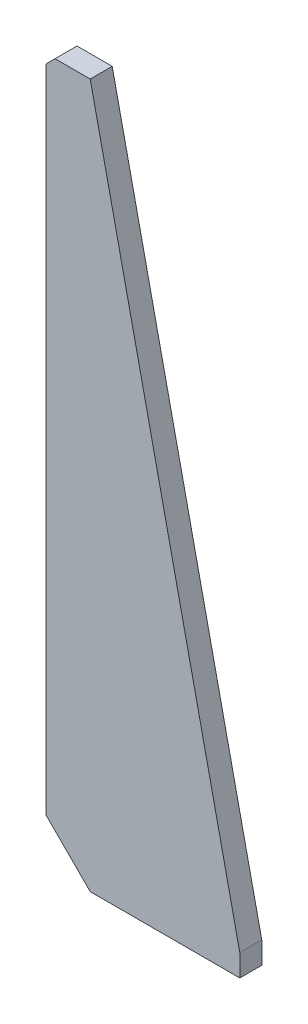
ISO-10303-21;
HEADER;
FILE_DESCRIPTION(('STEP AP214'),'2;1');
FILE_NAME('part.step','',(''),(''),'','','');
FILE_SCHEMA(('AUTOMOTIVE_DESIGN { 1 0 10303 214 1 1 1 1 }'));
ENDSEC;
DATA;
#1=APPLICATION_CONTEXT('core data for automotive mechanical design processes');
#2=APPLICATION_PROTOCOL_DEFINITION('international standard','automotive_design',2000,#1);
#3=PRODUCT_CONTEXT('',#1,'mechanical');
#4=PRODUCT('Part','Part','',(#3));
#5=PRODUCT_RELATED_PRODUCT_CATEGORY('part','',(#4));
#6=PRODUCT_DEFINITION_FORMATION('','',#4);
#7=PRODUCT_DEFINITION_CONTEXT('part definition',#1,'design');
#8=PRODUCT_DEFINITION('design','',#6,#7);
#9=PRODUCT_DEFINITION_SHAPE('','',#8);
#10=(LENGTH_UNIT() NAMED_UNIT(*) SI_UNIT(.MILLI.,.METRE.));
#11=(NAMED_UNIT(*) PLANE_ANGLE_UNIT() SI_UNIT($,.RADIAN.));
#12=(NAMED_UNIT(*) SI_UNIT($,.STERADIAN.) SOLID_ANGLE_UNIT());
#13=UNCERTAINTY_MEASURE_WITH_UNIT(LENGTH_MEASURE(1.E-05),#10,'distance_accuracy_value','');
#14=(GEOMETRIC_REPRESENTATION_CONTEXT(3) GLOBAL_UNCERTAINTY_ASSIGNED_CONTEXT((#13)) GLOBAL_UNIT_ASSIGNED_CONTEXT((#10,
#11,#12)) REPRESENTATION_CONTEXT('',''));
#15=CARTESIAN_POINT('',(0.,0.,0.));
#16=DIRECTION('',(0.,0.,1.));
#17=DIRECTION('',(1.,0.,0.));
#18=AXIS2_PLACEMENT_3D('',#15,#16,#17);
#19=CARTESIAN_POINT('',(44.,0.,2.5));
#20=DIRECTION('',(0.,1.,0.));
#21=DIRECTION('',(-1.,0.,0.));
#22=AXIS2_PLACEMENT_3D('',#19,#20,#21);
#23=PLANE('',#22);
#24=DIRECTION('',(1.,0.,0.));
#25=VECTOR('',#24,1.);
#26=CARTESIAN_POINT('',(44.,0.,2.5));
#27=LINE('',#26,#25);
#28=CARTESIAN_POINT('',(10.,0.,2.5));
#29=VERTEX_POINT('',#28);
#30=CARTESIAN_POINT('',(44.,0.,2.5));
#31=VERTEX_POINT('',#30);
#32=EDGE_CURVE('E102',#29,#31,#27,.T.);
#33=ORIENTED_EDGE('',*,*,#32,.F.);
#34=DIRECTION('',(0.,0.,-1.));
#35=VECTOR('',#34,1.);
#36=CARTESIAN_POINT('',(10.,0.,2.5));
#37=LINE('',#36,#35);
#38=CARTESIAN_POINT('',(10.,0.,-2.5));
#39=VERTEX_POINT('',#38);
#40=EDGE_CURVE('E127',#29,#39,#37,.T.);
#41=ORIENTED_EDGE('',*,*,#40,.T.);
#42=DIRECTION('',(1.,0.,0.));
#43=VECTOR('',#42,1.);
#44=CARTESIAN_POINT('',(44.,0.,-2.5));
#45=LINE('',#44,#43);
#46=CARTESIAN_POINT('',(44.,0.,-2.5));
#47=VERTEX_POINT('',#46);
#48=EDGE_CURVE('E125',#39,#47,#45,.T.);
#49=ORIENTED_EDGE('',*,*,#48,.T.);
#50=DIRECTION('',(0.,0.,-1.));
#51=VECTOR('',#50,1.);
#52=CARTESIAN_POINT('',(44.,0.,2.5));
#53=LINE('',#52,#51);
#54=EDGE_CURVE('E118',#31,#47,#53,.T.);
#55=ORIENTED_EDGE('',*,*,#54,.F.);
#56=EDGE_LOOP('',(#33,#41,#49,#55));
#57=FACE_BOUND('',#56,.T.);
#58=ADVANCED_FACE('F43',(#57),#23,.F.);
#59=CARTESIAN_POINT('',(44.,5.,2.5));
#60=DIRECTION('',(-1.,0.,0.));
#61=DIRECTION('',(0.,0.,1.));
#62=AXIS2_PLACEMENT_3D('',#59,#60,#61);
#63=PLANE('',#62);
#64=DIRECTION('',(0.,1.,0.));
#65=VECTOR('',#64,1.);
#66=CARTESIAN_POINT('',(44.,5.,-2.5));
#67=LINE('',#66,#65);
#68=CARTESIAN_POINT('',(44.,5.,-2.5));
#69=VERTEX_POINT('',#68);
#70=EDGE_CURVE('E166',#47,#69,#67,.T.);
#71=ORIENTED_EDGE('',*,*,#70,.T.);
#72=DIRECTION('',(0.,0.,-1.));
#73=VECTOR('',#72,1.);
#74=CARTESIAN_POINT('',(44.,5.,2.5));
#75=LINE('',#74,#73);
#76=CARTESIAN_POINT('',(44.,5.,2.5));
#77=VERTEX_POINT('',#76);
#78=EDGE_CURVE('E120',#77,#69,#75,.T.);
#79=ORIENTED_EDGE('',*,*,#78,.F.);
#80=DIRECTION('',(0.,1.,0.));
#81=VECTOR('',#80,1.);
#82=CARTESIAN_POINT('',(44.,5.,2.5));
#83=LINE('',#82,#81);
#84=EDGE_CURVE('E105',#31,#77,#83,.T.);
#85=ORIENTED_EDGE('',*,*,#84,.F.);
#86=ORIENTED_EDGE('',*,*,#54,.T.);
#87=EDGE_LOOP('',(#71,#79,#85,#86));
#88=FACE_BOUND('',#87,.T.);
#89=ADVANCED_FACE('F117',(#88),#63,.F.);
#90=CARTESIAN_POINT('',(10.,160.,2.5));
#91=DIRECTION('',(-0.976776520618856,-0.214260656135749,0.));
#92=DIRECTION('',(0.214260656135749,-0.976776520618856,0.));
#93=AXIS2_PLACEMENT_3D('',#90,#91,#92);
#94=PLANE('',#93);
#95=DIRECTION('',(-0.214260656135749,0.976776520618856,0.));
#96=VECTOR('',#95,1.);
#97=CARTESIAN_POINT('',(10.,160.,-2.5));
#98=LINE('',#97,#96);
#99=CARTESIAN_POINT('',(10.,160.,-2.5));
#100=VERTEX_POINT('',#99);
#101=EDGE_CURVE('E155',#69,#100,#98,.T.);
#102=ORIENTED_EDGE('',*,*,#101,.T.);
#103=DIRECTION('',(0.,0.,-1.));
#104=VECTOR('',#103,1.);
#105=CARTESIAN_POINT('',(10.,160.,2.5));
#106=LINE('',#105,#104);
#107=CARTESIAN_POINT('',(10.,160.,2.5));
#108=VERTEX_POINT('',#107);
#109=EDGE_CURVE('E131',#108,#100,#106,.T.);
#110=ORIENTED_EDGE('',*,*,#109,.F.);
#111=DIRECTION('',(-0.214260656135749,0.976776520618856,0.));
#112=VECTOR('',#111,1.);
#113=CARTESIAN_POINT('',(10.,160.,2.5));
#114=LINE('',#113,#112);
#115=EDGE_CURVE('E122',#77,#108,#114,.T.);
#116=ORIENTED_EDGE('',*,*,#115,.F.);
#117=ORIENTED_EDGE('',*,*,#78,.T.);
#118=EDGE_LOOP('',(#102,#110,#116,#117));
#119=FACE_BOUND('',#118,.T.);
#120=ADVANCED_FACE('F169',(#119),#94,.F.);
#121=CARTESIAN_POINT('',(0.,160.,2.5));
#122=DIRECTION('',(0.,-1.,0.));
#123=DIRECTION('',(0.,0.,-1.));
#124=AXIS2_PLACEMENT_3D('',#121,#122,#123);
#125=PLANE('',#124);
#126=DIRECTION('',(-1.,0.,0.));
#127=VECTOR('',#126,1.);
#128=CARTESIAN_POINT('',(0.,160.,-2.5));
#129=LINE('',#128,#127);
#130=CARTESIAN_POINT('',(2.,160.,-2.5));
#131=VERTEX_POINT('',#130);
#132=EDGE_CURVE('E153',#100,#131,#129,.T.);
#133=ORIENTED_EDGE('',*,*,#132,.T.);
#134=DIRECTION('',(0.,0.,1.));
#135=VECTOR('',#134,1.);
#136=CARTESIAN_POINT('',(2.,160.,2.5));
#137=LINE('',#136,#135);
#138=CARTESIAN_POINT('',(2.,160.,2.5));
#139=VERTEX_POINT('',#138);
#140=EDGE_CURVE('E52',#131,#139,#137,.T.);
#141=ORIENTED_EDGE('',*,*,#140,.T.);
#142=DIRECTION('',(-1.,0.,0.));
#143=VECTOR('',#142,1.);
#144=CARTESIAN_POINT('',(0.,160.,2.5));
#145=LINE('',#144,#143);
#146=EDGE_CURVE('E160',#108,#139,#145,.T.);
#147=ORIENTED_EDGE('',*,*,#146,.F.);
#148=ORIENTED_EDGE('',*,*,#109,.T.);
#149=EDGE_LOOP('',(#133,#141,#147,#148));
#150=FACE_BOUND('',#149,.T.);
#151=ADVANCED_FACE('F170',(#150),#125,.F.);
#152=CARTESIAN_POINT('',(0.,0.,2.5));
#153=DIRECTION('',(1.,0.,0.));
#154=DIRECTION('',(0.,0.,-1.));
#155=AXIS2_PLACEMENT_3D('',#152,#153,#154);
#156=PLANE('',#155);
#157=DIRECTION('',(0.,-1.,0.));
#158=VECTOR('',#157,1.);
#159=CARTESIAN_POINT('',(0.,0.,2.5));
#160=LINE('',#159,#158);
#161=CARTESIAN_POINT('',(0.,158.,2.5));
#162=VERTEX_POINT('',#161);
#163=CARTESIAN_POINT('',(0.,10.,2.5));
#164=VERTEX_POINT('',#163);
#165=EDGE_CURVE('E148',#162,#164,#160,.T.);
#166=ORIENTED_EDGE('',*,*,#165,.F.);
#167=DIRECTION('',(0.,0.,-1.));
#168=VECTOR('',#167,1.);
#169=CARTESIAN_POINT('',(0.,158.,2.5));
#170=LINE('',#169,#168);
#171=CARTESIAN_POINT('',(0.,158.,-2.5));
#172=VERTEX_POINT('',#171);
#173=EDGE_CURVE('E141',#162,#172,#170,.T.);
#174=ORIENTED_EDGE('',*,*,#173,.T.);
#175=DIRECTION('',(0.,-1.,0.));
#176=VECTOR('',#175,1.);
#177=CARTESIAN_POINT('',(0.,0.,-2.5));
#178=LINE('',#177,#176);
#179=CARTESIAN_POINT('',(0.,10.,-2.5));
#180=VERTEX_POINT('',#179);
#181=EDGE_CURVE('E113',#172,#180,#178,.T.);
#182=ORIENTED_EDGE('',*,*,#181,.T.);
#183=DIRECTION('',(0.,0.,1.));
#184=VECTOR('',#183,1.);
#185=CARTESIAN_POINT('',(0.,10.,2.5));
#186=LINE('',#185,#184);
#187=EDGE_CURVE('E137',#180,#164,#186,.T.);
#188=ORIENTED_EDGE('',*,*,#187,.T.);
#189=EDGE_LOOP('',(#166,#174,#182,#188));
#190=FACE_BOUND('',#189,.T.);
#191=ADVANCED_FACE('F147',(#190),#156,.F.);
#192=CARTESIAN_POINT('',(0.,0.,2.5));
#193=DIRECTION('',(0.,0.,-1.));
#194=DIRECTION('',(-1.,0.,0.));
#195=AXIS2_PLACEMENT_3D('',#192,#193,#194);
#196=PLANE('',#195);
#197=ORIENTED_EDGE('',*,*,#146,.T.);
#198=DIRECTION('',(0.707106781186543,0.707106781186552,0.));
#199=VECTOR('',#198,1.);
#200=CARTESIAN_POINT('',(0.,158.,2.5));
#201=LINE('',#200,#199);
#202=EDGE_CURVE('E11',#139,#162,#201,.F.);
#203=ORIENTED_EDGE('',*,*,#202,.T.);
#204=ORIENTED_EDGE('',*,*,#165,.T.);
#205=DIRECTION('',(-0.707106781186546,0.707106781186549,0.));
#206=VECTOR('',#205,1.);
#207=CARTESIAN_POINT('',(10.,0.,2.5));
#208=LINE('',#207,#206);
#209=EDGE_CURVE('E108',#164,#29,#208,.F.);
#210=ORIENTED_EDGE('',*,*,#209,.T.);
#211=ORIENTED_EDGE('',*,*,#32,.T.);
#212=ORIENTED_EDGE('',*,*,#84,.T.);
#213=ORIENTED_EDGE('',*,*,#115,.T.);
#214=EDGE_LOOP('',(#197,#203,#204,#210,#211,#212,#213));
#215=FACE_BOUND('',#214,.T.);
#216=ADVANCED_FACE('F104',(#215),#196,.F.);
#217=CARTESIAN_POINT('',(0.,0.,-2.5));
#218=DIRECTION('',(0.,0.,-1.));
#219=DIRECTION('',(-1.,0.,0.));
#220=AXIS2_PLACEMENT_3D('',#217,#218,#219);
#221=PLANE('',#220);
#222=ORIENTED_EDGE('',*,*,#181,.F.);
#223=DIRECTION('',(-0.707106781186543,-0.707106781186552,0.));
#224=VECTOR('',#223,1.);
#225=CARTESIAN_POINT('',(-79.,78.9999999999989,-2.5));
#226=LINE('',#225,#224);
#227=EDGE_CURVE('E66',#172,#131,#226,.F.);
#228=ORIENTED_EDGE('',*,*,#227,.T.);
#229=ORIENTED_EDGE('',*,*,#132,.F.);
#230=ORIENTED_EDGE('',*,*,#101,.F.);
#231=ORIENTED_EDGE('',*,*,#70,.F.);
#232=ORIENTED_EDGE('',*,*,#48,.F.);
#233=DIRECTION('',(0.707106781186546,-0.707106781186549,0.));
#234=VECTOR('',#233,1.);
#235=CARTESIAN_POINT('',(5.00000000000002,5.,-2.5));
#236=LINE('',#235,#234);
#237=EDGE_CURVE('E129',#39,#180,#236,.F.);
#238=ORIENTED_EDGE('',*,*,#237,.T.);
#239=EDGE_LOOP('',(#222,#228,#229,#230,#231,#232,#238));
#240=FACE_BOUND('',#239,.T.);
#241=ADVANCED_FACE('F151',(#240),#221,.T.);
#242=CARTESIAN_POINT('',(10.,0.,2.5));
#243=DIRECTION('',(0.707106781186549,0.707106781186546,0.));
#244=DIRECTION('',(0.,0.,-1.));
#245=AXIS2_PLACEMENT_3D('',#242,#243,#244);
#246=PLANE('',#245);
#247=ORIENTED_EDGE('',*,*,#209,.F.);
#248=ORIENTED_EDGE('',*,*,#187,.F.);
#249=ORIENTED_EDGE('',*,*,#237,.F.);
#250=ORIENTED_EDGE('',*,*,#40,.F.);
#251=EDGE_LOOP('',(#247,#248,#249,#250));
#252=FACE_BOUND('',#251,.T.);
#253=ADVANCED_FACE('F172',(#252),#246,.F.);
#254=CARTESIAN_POINT('',(0.,158.,2.5));
#255=DIRECTION('',(0.707106781186552,-0.707106781186542,0.));
#256=DIRECTION('',(0.,0.,-1.));
#257=AXIS2_PLACEMENT_3D('',#254,#255,#256);
#258=PLANE('',#257);
#259=ORIENTED_EDGE('',*,*,#202,.F.);
#260=ORIENTED_EDGE('',*,*,#140,.F.);
#261=ORIENTED_EDGE('',*,*,#227,.F.);
#262=ORIENTED_EDGE('',*,*,#173,.F.);
#263=EDGE_LOOP('',(#259,#260,#261,#262));
#264=FACE_BOUND('',#263,.T.);
#265=ADVANCED_FACE('F46',(#264),#258,.F.);
#266=CLOSED_SHELL('',(#58,#89,#120,#151,#191,#216,#241,#253,#265));
#267=MANIFOLD_SOLID_BREP('B2',#266);
#268=ADVANCED_BREP_SHAPE_REPRESENTATION('',(#18,#267),#14);
#269=SHAPE_DEFINITION_REPRESENTATION(#9,#268);
ENDSEC;
END-ISO-10303-21;
